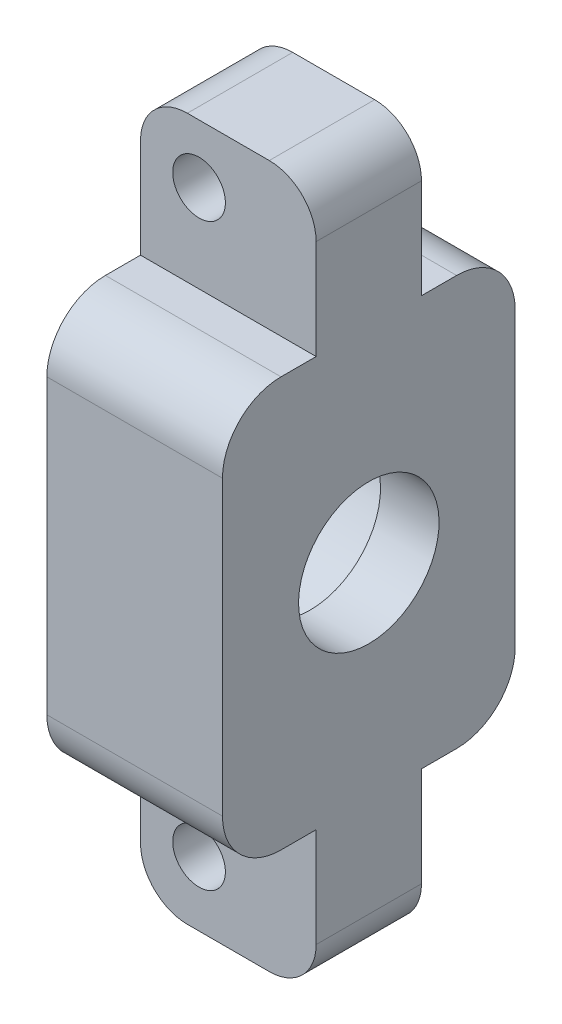
ISO-10303-21;
HEADER;
FILE_DESCRIPTION(('STEP AP214'),'2;1');
FILE_NAME('part.step','',(''),(''),'','','');
FILE_SCHEMA(('AUTOMOTIVE_DESIGN { 1 0 10303 214 1 1 1 1 }'));
ENDSEC;
DATA;
#1=APPLICATION_CONTEXT('core data for automotive mechanical design processes');
#2=APPLICATION_PROTOCOL_DEFINITION('international standard','automotive_design',2000,#1);
#3=PRODUCT_CONTEXT('',#1,'mechanical');
#4=PRODUCT('Part','Part','',(#3));
#5=PRODUCT_RELATED_PRODUCT_CATEGORY('part','',(#4));
#6=PRODUCT_DEFINITION_FORMATION('','',#4);
#7=PRODUCT_DEFINITION_CONTEXT('part definition',#1,'design');
#8=PRODUCT_DEFINITION('design','',#6,#7);
#9=PRODUCT_DEFINITION_SHAPE('','',#8);
#10=(LENGTH_UNIT() NAMED_UNIT(*) SI_UNIT(.MILLI.,.METRE.));
#11=(NAMED_UNIT(*) PLANE_ANGLE_UNIT() SI_UNIT($,.RADIAN.));
#12=(NAMED_UNIT(*) SI_UNIT($,.STERADIAN.) SOLID_ANGLE_UNIT());
#13=UNCERTAINTY_MEASURE_WITH_UNIT(LENGTH_MEASURE(1.E-05),#10,'distance_accuracy_value','');
#14=(GEOMETRIC_REPRESENTATION_CONTEXT(3) GLOBAL_UNCERTAINTY_ASSIGNED_CONTEXT((#13)) GLOBAL_UNIT_ASSIGNED_CONTEXT((#10,
#11,#12)) REPRESENTATION_CONTEXT('',''));
#15=CARTESIAN_POINT('',(0.,0.,0.));
#16=DIRECTION('',(0.,0.,1.));
#17=DIRECTION('',(1.,0.,0.));
#18=AXIS2_PLACEMENT_3D('',#15,#16,#17);
#19=CARTESIAN_POINT('',(7.50000000000001,0.,0.));
#20=DIRECTION('',(-1.,0.,0.));
#21=DIRECTION('',(0.,-1.,0.));
#22=AXIS2_PLACEMENT_3D('',#19,#20,#21);
#23=CYLINDRICAL_SURFACE('',#22,6.);
#24=CARTESIAN_POINT('',(7.50000000000001,0.,0.));
#25=DIRECTION('',(-1.,0.,0.));
#26=DIRECTION('',(0.,-1.,0.));
#27=AXIS2_PLACEMENT_3D('',#24,#25,#26);
#28=CIRCLE('',#27,6.);
#29=CARTESIAN_POINT('',(7.50000000000001,-6.,0.));
#30=VERTEX_POINT('',#29);
#31=EDGE_CURVE('E485',#30,#30,#28,.T.);
#32=ORIENTED_EDGE('',*,*,#31,.F.);
#33=EDGE_LOOP('',(#32));
#34=FACE_BOUND('',#33,.T.);
#35=CARTESIAN_POINT('',(2.5,0.,0.));
#36=DIRECTION('',(-1.,0.,0.));
#37=DIRECTION('',(0.,-1.,0.));
#38=AXIS2_PLACEMENT_3D('',#35,#36,#37);
#39=CIRCLE('',#38,6.);
#40=CARTESIAN_POINT('',(2.5,-6.,0.));
#41=VERTEX_POINT('',#40);
#42=EDGE_CURVE('E43',#41,#41,#39,.F.);
#43=ORIENTED_EDGE('',*,*,#42,.F.);
#44=EDGE_LOOP('',(#43));
#45=FACE_BOUND('',#44,.T.);
#46=ADVANCED_FACE('F39',(#34,#45),#23,.F.);
#47=CARTESIAN_POINT('',(7.5,30.,12.5));
#48=DIRECTION('',(-1.,0.,0.));
#49=DIRECTION('',(0.,-1.,0.));
#50=AXIS2_PLACEMENT_3D('',#47,#48,#49);
#51=PLANE('',#50);
#52=ORIENTED_EDGE('',*,*,#31,.T.);
#53=EDGE_LOOP('',(#52));
#54=FACE_BOUND('',#53,.T.);
#55=DIRECTION('',(0.,1.,0.));
#56=VECTOR('',#55,1.);
#57=CARTESIAN_POINT('',(7.5,0.,4.5));
#58=LINE('',#57,#56);
#59=CARTESIAN_POINT('',(7.5,-26.,4.5));
#60=VERTEX_POINT('',#59);
#61=CARTESIAN_POINT('',(7.5,-17.5,4.5));
#62=VERTEX_POINT('',#61);
#63=EDGE_CURVE('E248',#60,#62,#58,.T.);
#64=ORIENTED_EDGE('',*,*,#63,.F.);
#65=DIRECTION('',(0.,0.,-1.));
#66=VECTOR('',#65,1.);
#67=CARTESIAN_POINT('',(7.5,-26.,12.5));
#68=LINE('',#67,#66);
#69=CARTESIAN_POINT('',(7.5,-26.,-4.5));
#70=VERTEX_POINT('',#69);
#71=EDGE_CURVE('E302',#60,#70,#68,.T.);
#72=ORIENTED_EDGE('',*,*,#71,.T.);
#73=DIRECTION('',(0.,1.,0.));
#74=VECTOR('',#73,1.);
#75=CARTESIAN_POINT('',(7.5,0.,-4.5));
#76=LINE('',#75,#74);
#77=CARTESIAN_POINT('',(7.5,-17.5,-4.5));
#78=VERTEX_POINT('',#77);
#79=EDGE_CURVE('E197',#70,#78,#76,.T.);
#80=ORIENTED_EDGE('',*,*,#79,.T.);
#81=DIRECTION('',(0.,0.,1.));
#82=VECTOR('',#81,1.);
#83=CARTESIAN_POINT('',(7.5,-17.5,0.));
#84=LINE('',#83,#82);
#85=CARTESIAN_POINT('',(7.5,-17.5,-7.5));
#86=VERTEX_POINT('',#85);
#87=EDGE_CURVE('E205',#86,#78,#84,.T.);
#88=ORIENTED_EDGE('',*,*,#87,.F.);
#89=CARTESIAN_POINT('',(7.5,-12.5,-7.5));
#90=DIRECTION('',(-1.,0.,0.));
#91=DIRECTION('',(0.,-1.,0.));
#92=AXIS2_PLACEMENT_3D('',#89,#90,#91);
#93=CIRCLE('',#92,5.);
#94=CARTESIAN_POINT('',(7.5,-12.5,-12.5));
#95=VERTEX_POINT('',#94);
#96=EDGE_CURVE('E280',#86,#95,#93,.F.);
#97=ORIENTED_EDGE('',*,*,#96,.T.);
#98=DIRECTION('',(0.,1.,0.));
#99=VECTOR('',#98,1.);
#100=CARTESIAN_POINT('',(7.5,30.,-12.5));
#101=LINE('',#100,#99);
#102=CARTESIAN_POINT('',(7.5,12.5,-12.5));
#103=VERTEX_POINT('',#102);
#104=EDGE_CURVE('E254',#95,#103,#101,.T.);
#105=ORIENTED_EDGE('',*,*,#104,.T.);
#106=CARTESIAN_POINT('',(7.5,12.5,-7.5));
#107=DIRECTION('',(-1.,0.,0.));
#108=DIRECTION('',(0.,-1.,0.));
#109=AXIS2_PLACEMENT_3D('',#106,#107,#108);
#110=CIRCLE('',#109,5.);
#111=CARTESIAN_POINT('',(7.5,17.5,-7.5));
#112=VERTEX_POINT('',#111);
#113=EDGE_CURVE('E274',#103,#112,#110,.F.);
#114=ORIENTED_EDGE('',*,*,#113,.T.);
#115=DIRECTION('',(0.,0.,1.));
#116=VECTOR('',#115,1.);
#117=CARTESIAN_POINT('',(7.5,17.5,0.));
#118=LINE('',#117,#116);
#119=CARTESIAN_POINT('',(7.5,17.5,-4.5));
#120=VERTEX_POINT('',#119);
#121=EDGE_CURVE('E220',#112,#120,#118,.T.);
#122=ORIENTED_EDGE('',*,*,#121,.T.);
#123=DIRECTION('',(0.,-1.,0.));
#124=VECTOR('',#123,1.);
#125=CARTESIAN_POINT('',(7.5,0.,-4.5));
#126=LINE('',#125,#124);
#127=CARTESIAN_POINT('',(7.5,26.,-4.5));
#128=VERTEX_POINT('',#127);
#129=EDGE_CURVE('E212',#128,#120,#126,.T.);
#130=ORIENTED_EDGE('',*,*,#129,.F.);
#131=DIRECTION('',(0.,0.,-1.));
#132=VECTOR('',#131,1.);
#133=CARTESIAN_POINT('',(7.5,26.,12.5));
#134=LINE('',#133,#132);
#135=CARTESIAN_POINT('',(7.5,26.,4.5));
#136=VERTEX_POINT('',#135);
#137=EDGE_CURVE('E305',#128,#136,#134,.F.);
#138=ORIENTED_EDGE('',*,*,#137,.T.);
#139=DIRECTION('',(0.,-1.,0.));
#140=VECTOR('',#139,1.);
#141=CARTESIAN_POINT('',(7.5,0.,4.5));
#142=LINE('',#141,#140);
#143=CARTESIAN_POINT('',(7.5,17.5,4.5));
#144=VERTEX_POINT('',#143);
#145=EDGE_CURVE('E233',#136,#144,#142,.T.);
#146=ORIENTED_EDGE('',*,*,#145,.T.);
#147=DIRECTION('',(0.,0.,-1.));
#148=VECTOR('',#147,1.);
#149=CARTESIAN_POINT('',(7.5,17.5,0.));
#150=LINE('',#149,#148);
#151=CARTESIAN_POINT('',(7.5,17.5,7.5));
#152=VERTEX_POINT('',#151);
#153=EDGE_CURVE('E232',#152,#144,#150,.T.);
#154=ORIENTED_EDGE('',*,*,#153,.F.);
#155=CARTESIAN_POINT('',(7.5,12.5,7.5));
#156=DIRECTION('',(-1.,0.,0.));
#157=DIRECTION('',(0.,-1.,0.));
#158=AXIS2_PLACEMENT_3D('',#155,#156,#157);
#159=CIRCLE('',#158,5.);
#160=CARTESIAN_POINT('',(7.5,12.5,12.5));
#161=VERTEX_POINT('',#160);
#162=EDGE_CURVE('E272',#152,#161,#159,.F.);
#163=ORIENTED_EDGE('',*,*,#162,.T.);
#164=DIRECTION('',(0.,1.,0.));
#165=VECTOR('',#164,1.);
#166=CARTESIAN_POINT('',(7.5,30.,12.5));
#167=LINE('',#166,#165);
#168=CARTESIAN_POINT('',(7.5,-12.5,12.5));
#169=VERTEX_POINT('',#168);
#170=EDGE_CURVE('E256',#169,#161,#167,.T.);
#171=ORIENTED_EDGE('',*,*,#170,.F.);
#172=CARTESIAN_POINT('',(7.5,-12.5,7.5));
#173=DIRECTION('',(-1.,0.,0.));
#174=DIRECTION('',(0.,-1.,0.));
#175=AXIS2_PLACEMENT_3D('',#172,#173,#174);
#176=CIRCLE('',#175,5.);
#177=CARTESIAN_POINT('',(7.5,-17.5,7.5));
#178=VERTEX_POINT('',#177);
#179=EDGE_CURVE('E276',#169,#178,#176,.F.);
#180=ORIENTED_EDGE('',*,*,#179,.T.);
#181=DIRECTION('',(0.,0.,-1.));
#182=VECTOR('',#181,1.);
#183=CARTESIAN_POINT('',(7.5,-17.5,0.));
#184=LINE('',#183,#182);
#185=EDGE_CURVE('E206',#178,#62,#184,.T.);
#186=ORIENTED_EDGE('',*,*,#185,.T.);
#187=EDGE_LOOP('',(#64,#72,#80,#88,#97,#105,#114,#122,#130,#138,#146,#154,#163,#171,#180,#186));
#188=FACE_BOUND('',#187,.T.);
#189=ADVANCED_FACE('F353',(#54,#188),#51,.F.);
#190=CARTESIAN_POINT('',(-7.5,30.,12.5));
#191=DIRECTION('',(0.,-1.,0.));
#192=DIRECTION('',(0.,0.,-1.));
#193=AXIS2_PLACEMENT_3D('',#190,#191,#192);
#194=PLANE('',#193);
#195=DIRECTION('',(1.,0.,0.));
#196=VECTOR('',#195,1.);
#197=CARTESIAN_POINT('',(-7.50000000000001,30.,-4.5));
#198=LINE('',#197,#196);
#199=CARTESIAN_POINT('',(-3.5,30.,-4.5));
#200=VERTEX_POINT('',#199);
#201=CARTESIAN_POINT('',(3.5,30.,-4.5));
#202=VERTEX_POINT('',#201);
#203=EDGE_CURVE('E216',#200,#202,#198,.T.);
#204=ORIENTED_EDGE('',*,*,#203,.F.);
#205=DIRECTION('',(0.,0.,-1.));
#206=VECTOR('',#205,1.);
#207=CARTESIAN_POINT('',(-3.5,30.,12.5));
#208=LINE('',#207,#206);
#209=CARTESIAN_POINT('',(-3.5,30.,4.5));
#210=VERTEX_POINT('',#209);
#211=EDGE_CURVE('E62',#200,#210,#208,.F.);
#212=ORIENTED_EDGE('',*,*,#211,.T.);
#213=DIRECTION('',(1.,0.,0.));
#214=VECTOR('',#213,1.);
#215=CARTESIAN_POINT('',(-7.50000000000001,30.,4.5));
#216=LINE('',#215,#214);
#217=CARTESIAN_POINT('',(3.5,30.,4.5));
#218=VERTEX_POINT('',#217);
#219=EDGE_CURVE('E219',#210,#218,#216,.T.);
#220=ORIENTED_EDGE('',*,*,#219,.T.);
#221=DIRECTION('',(0.,0.,-1.));
#222=VECTOR('',#221,1.);
#223=CARTESIAN_POINT('',(3.5,30.,12.5));
#224=LINE('',#223,#222);
#225=EDGE_CURVE('E327',#218,#202,#224,.T.);
#226=ORIENTED_EDGE('',*,*,#225,.T.);
#227=EDGE_LOOP('',(#204,#212,#220,#226));
#228=FACE_BOUND('',#227,.T.);
#229=ADVANCED_FACE('F334',(#228),#194,.F.);
#230=CARTESIAN_POINT('',(-7.5,30.,12.5));
#231=DIRECTION('',(1.,0.,0.));
#232=DIRECTION('',(0.,1.,0.));
#233=AXIS2_PLACEMENT_3D('',#230,#231,#232);
#234=PLANE('',#233);
#235=CARTESIAN_POINT('',(-7.5,0.,0.));
#236=DIRECTION('',(-1.,0.,0.));
#237=DIRECTION('',(0.,-1.,0.));
#238=AXIS2_PLACEMENT_3D('',#235,#236,#237);
#239=CIRCLE('',#238,10.);
#240=CARTESIAN_POINT('',(-7.5,-10.,0.));
#241=VERTEX_POINT('',#240);
#242=EDGE_CURVE('E490',#241,#241,#239,.T.);
#243=ORIENTED_EDGE('',*,*,#242,.F.);
#244=EDGE_LOOP('',(#243));
#245=FACE_BOUND('',#244,.T.);
#246=DIRECTION('',(0.,1.,0.));
#247=VECTOR('',#246,1.);
#248=CARTESIAN_POINT('',(-7.50000000000001,0.,-4.5));
#249=LINE('',#248,#247);
#250=CARTESIAN_POINT('',(-7.5,-26.,-4.5));
#251=VERTEX_POINT('',#250);
#252=CARTESIAN_POINT('',(-7.50000000000001,-17.5,-4.5));
#253=VERTEX_POINT('',#252);
#254=EDGE_CURVE('E180',#251,#253,#249,.T.);
#255=ORIENTED_EDGE('',*,*,#254,.F.);
#256=DIRECTION('',(0.,0.,-1.));
#257=VECTOR('',#256,1.);
#258=CARTESIAN_POINT('',(-7.5,-26.,12.5));
#259=LINE('',#258,#257);
#260=CARTESIAN_POINT('',(-7.5,-26.,4.5));
#261=VERTEX_POINT('',#260);
#262=EDGE_CURVE('E325',#251,#261,#259,.F.);
#263=ORIENTED_EDGE('',*,*,#262,.T.);
#264=DIRECTION('',(0.,1.,0.));
#265=VECTOR('',#264,1.);
#266=CARTESIAN_POINT('',(-7.50000000000001,0.,4.5));
#267=LINE('',#266,#265);
#268=CARTESIAN_POINT('',(-7.50000000000001,-17.5,4.5));
#269=VERTEX_POINT('',#268);
#270=EDGE_CURVE('E243',#261,#269,#267,.T.);
#271=ORIENTED_EDGE('',*,*,#270,.T.);
#272=DIRECTION('',(0.,0.,-1.));
#273=VECTOR('',#272,1.);
#274=CARTESIAN_POINT('',(-7.50000000000001,-17.5,0.));
#275=LINE('',#274,#273);
#276=CARTESIAN_POINT('',(-7.50000000000001,-17.5,7.5));
#277=VERTEX_POINT('',#276);
#278=EDGE_CURVE('E244',#277,#269,#275,.T.);
#279=ORIENTED_EDGE('',*,*,#278,.F.);
#280=CARTESIAN_POINT('',(-7.5,-12.5,7.5));
#281=DIRECTION('',(1.,0.,0.));
#282=DIRECTION('',(0.,1.,0.));
#283=AXIS2_PLACEMENT_3D('',#280,#281,#282);
#284=CIRCLE('',#283,5.);
#285=CARTESIAN_POINT('',(-7.5,-12.5,12.5));
#286=VERTEX_POINT('',#285);
#287=EDGE_CURVE('E286',#277,#286,#284,.F.);
#288=ORIENTED_EDGE('',*,*,#287,.T.);
#289=DIRECTION('',(0.,-1.,0.));
#290=VECTOR('',#289,1.);
#291=CARTESIAN_POINT('',(-7.5,30.,12.5));
#292=LINE('',#291,#290);
#293=CARTESIAN_POINT('',(-7.5,12.5,12.5));
#294=VERTEX_POINT('',#293);
#295=EDGE_CURVE('E261',#294,#286,#292,.T.);
#296=ORIENTED_EDGE('',*,*,#295,.F.);
#297=CARTESIAN_POINT('',(-7.5,12.5,7.5));
#298=DIRECTION('',(1.,0.,0.));
#299=DIRECTION('',(0.,1.,0.));
#300=AXIS2_PLACEMENT_3D('',#297,#298,#299);
#301=CIRCLE('',#300,5.);
#302=CARTESIAN_POINT('',(-7.50000000000001,17.5,7.5));
#303=VERTEX_POINT('',#302);
#304=EDGE_CURVE('E285',#294,#303,#301,.F.);
#305=ORIENTED_EDGE('',*,*,#304,.T.);
#306=DIRECTION('',(0.,0.,-1.));
#307=VECTOR('',#306,1.);
#308=CARTESIAN_POINT('',(-7.50000000000001,17.5,0.));
#309=LINE('',#308,#307);
#310=CARTESIAN_POINT('',(-7.50000000000001,17.5,4.5));
#311=VERTEX_POINT('',#310);
#312=EDGE_CURVE('E229',#303,#311,#309,.T.);
#313=ORIENTED_EDGE('',*,*,#312,.T.);
#314=DIRECTION('',(0.,-1.,0.));
#315=VECTOR('',#314,1.);
#316=CARTESIAN_POINT('',(-7.50000000000001,0.,4.5));
#317=LINE('',#316,#315);
#318=CARTESIAN_POINT('',(-7.50000000000001,26.,4.5));
#319=VERTEX_POINT('',#318);
#320=EDGE_CURVE('E228',#319,#311,#317,.T.);
#321=ORIENTED_EDGE('',*,*,#320,.F.);
#322=DIRECTION('',(0.,0.,-1.));
#323=VECTOR('',#322,1.);
#324=CARTESIAN_POINT('',(-7.5,26.,12.5));
#325=LINE('',#324,#323);
#326=CARTESIAN_POINT('',(-7.50000000000001,26.,-4.5));
#327=VERTEX_POINT('',#326);
#328=EDGE_CURVE('E317',#319,#327,#325,.T.);
#329=ORIENTED_EDGE('',*,*,#328,.T.);
#330=DIRECTION('',(0.,-1.,0.));
#331=VECTOR('',#330,1.);
#332=CARTESIAN_POINT('',(-7.50000000000001,0.,-4.5));
#333=LINE('',#332,#331);
#334=CARTESIAN_POINT('',(-7.50000000000001,17.5,-4.5));
#335=VERTEX_POINT('',#334);
#336=EDGE_CURVE('E213',#327,#335,#333,.T.);
#337=ORIENTED_EDGE('',*,*,#336,.T.);
#338=DIRECTION('',(0.,0.,1.));
#339=VECTOR('',#338,1.);
#340=CARTESIAN_POINT('',(-7.50000000000001,17.5,0.));
#341=LINE('',#340,#339);
#342=CARTESIAN_POINT('',(-7.50000000000001,17.5,-7.5));
#343=VERTEX_POINT('',#342);
#344=EDGE_CURVE('E209',#343,#335,#341,.T.);
#345=ORIENTED_EDGE('',*,*,#344,.F.);
#346=CARTESIAN_POINT('',(-7.5,12.5,-7.5));
#347=DIRECTION('',(1.,0.,0.));
#348=DIRECTION('',(0.,1.,0.));
#349=AXIS2_PLACEMENT_3D('',#346,#347,#348);
#350=CIRCLE('',#349,5.);
#351=CARTESIAN_POINT('',(-7.5,12.5,-12.5));
#352=VERTEX_POINT('',#351);
#353=EDGE_CURVE('E283',#343,#352,#350,.F.);
#354=ORIENTED_EDGE('',*,*,#353,.T.);
#355=DIRECTION('',(0.,-1.,0.));
#356=VECTOR('',#355,1.);
#357=CARTESIAN_POINT('',(-7.5,30.,-12.5));
#358=LINE('',#357,#356);
#359=CARTESIAN_POINT('',(-7.5,-12.5,-12.5));
#360=VERTEX_POINT('',#359);
#361=EDGE_CURVE('E265',#352,#360,#358,.T.);
#362=ORIENTED_EDGE('',*,*,#361,.T.);
#363=CARTESIAN_POINT('',(-7.5,-12.5,-7.5));
#364=DIRECTION('',(1.,0.,0.));
#365=DIRECTION('',(0.,1.,0.));
#366=AXIS2_PLACEMENT_3D('',#363,#364,#365);
#367=CIRCLE('',#366,5.);
#368=CARTESIAN_POINT('',(-7.50000000000001,-17.5,-7.5));
#369=VERTEX_POINT('',#368);
#370=EDGE_CURVE('E191',#360,#369,#367,.F.);
#371=ORIENTED_EDGE('',*,*,#370,.T.);
#372=DIRECTION('',(0.,0.,1.));
#373=VECTOR('',#372,1.);
#374=CARTESIAN_POINT('',(-7.50000000000001,-17.5,0.));
#375=LINE('',#374,#373);
#376=EDGE_CURVE('E189',#369,#253,#375,.T.);
#377=ORIENTED_EDGE('',*,*,#376,.T.);
#378=EDGE_LOOP('',(#255,#263,#271,#279,#288,#296,#305,#313,#321,#329,#337,#345,#354,#362,#371,#377));
#379=FACE_BOUND('',#378,.T.);
#380=ADVANCED_FACE('F188',(#245,#379),#234,.F.);
#381=CARTESIAN_POINT('',(-7.5,-30.,12.5));
#382=DIRECTION('',(0.,1.,0.));
#383=DIRECTION('',(0.,0.,1.));
#384=AXIS2_PLACEMENT_3D('',#381,#382,#383);
#385=PLANE('',#384);
#386=DIRECTION('',(1.,0.,0.));
#387=VECTOR('',#386,1.);
#388=CARTESIAN_POINT('',(-7.5,-30.,-4.5));
#389=LINE('',#388,#387);
#390=CARTESIAN_POINT('',(-3.5,-30.,-4.5));
#391=VERTEX_POINT('',#390);
#392=CARTESIAN_POINT('',(3.5,-30.,-4.5));
#393=VERTEX_POINT('',#392);
#394=EDGE_CURVE('E201',#391,#393,#389,.T.);
#395=ORIENTED_EDGE('',*,*,#394,.T.);
#396=DIRECTION('',(0.,0.,-1.));
#397=VECTOR('',#396,1.);
#398=CARTESIAN_POINT('',(3.5,-30.,12.5));
#399=LINE('',#398,#397);
#400=CARTESIAN_POINT('',(3.5,-30.,4.5));
#401=VERTEX_POINT('',#400);
#402=EDGE_CURVE('E311',#393,#401,#399,.F.);
#403=ORIENTED_EDGE('',*,*,#402,.T.);
#404=DIRECTION('',(1.,0.,0.));
#405=VECTOR('',#404,1.);
#406=CARTESIAN_POINT('',(-7.5,-30.,4.5));
#407=LINE('',#406,#405);
#408=CARTESIAN_POINT('',(-3.5,-30.,4.5));
#409=VERTEX_POINT('',#408);
#410=EDGE_CURVE('E246',#409,#401,#407,.T.);
#411=ORIENTED_EDGE('',*,*,#410,.F.);
#412=DIRECTION('',(0.,0.,-1.));
#413=VECTOR('',#412,1.);
#414=CARTESIAN_POINT('',(-3.5,-30.,12.5));
#415=LINE('',#414,#413);
#416=EDGE_CURVE('E309',#409,#391,#415,.T.);
#417=ORIENTED_EDGE('',*,*,#416,.T.);
#418=EDGE_LOOP('',(#395,#403,#411,#417));
#419=FACE_BOUND('',#418,.T.);
#420=ADVANCED_FACE('F420',(#419),#385,.F.);
#421=CARTESIAN_POINT('',(0.,0.,12.5));
#422=DIRECTION('',(0.,0.,1.));
#423=DIRECTION('',(1.,0.,0.));
#424=AXIS2_PLACEMENT_3D('',#421,#422,#423);
#425=PLANE('',#424);
#426=ORIENTED_EDGE('',*,*,#295,.T.);
#427=DIRECTION('',(1.,0.,0.));
#428=VECTOR('',#427,1.);
#429=CARTESIAN_POINT('',(0.,-12.5,12.5));
#430=LINE('',#429,#428);
#431=EDGE_CURVE('E269',#286,#169,#430,.T.);
#432=ORIENTED_EDGE('',*,*,#431,.T.);
#433=ORIENTED_EDGE('',*,*,#170,.T.);
#434=DIRECTION('',(1.,0.,0.));
#435=VECTOR('',#434,1.);
#436=CARTESIAN_POINT('',(-7.5,12.5,12.5));
#437=LINE('',#436,#435);
#438=EDGE_CURVE('E264',#161,#294,#437,.F.);
#439=ORIENTED_EDGE('',*,*,#438,.T.);
#440=EDGE_LOOP('',(#426,#432,#433,#439));
#441=FACE_BOUND('',#440,.T.);
#442=ADVANCED_FACE('F418',(#441),#425,.T.);
#443=CARTESIAN_POINT('',(0.,0.,-12.5));
#444=DIRECTION('',(0.,0.,1.));
#445=DIRECTION('',(1.,0.,0.));
#446=AXIS2_PLACEMENT_3D('',#443,#444,#445);
#447=PLANE('',#446);
#448=ORIENTED_EDGE('',*,*,#104,.F.);
#449=DIRECTION('',(1.,0.,0.));
#450=VECTOR('',#449,1.);
#451=CARTESIAN_POINT('',(0.,-12.5,-12.5));
#452=LINE('',#451,#450);
#453=EDGE_CURVE('E293',#95,#360,#452,.F.);
#454=ORIENTED_EDGE('',*,*,#453,.T.);
#455=ORIENTED_EDGE('',*,*,#361,.F.);
#456=DIRECTION('',(1.,0.,0.));
#457=VECTOR('',#456,1.);
#458=CARTESIAN_POINT('',(7.5,12.5,-12.5));
#459=LINE('',#458,#457);
#460=EDGE_CURVE('E295',#352,#103,#459,.T.);
#461=ORIENTED_EDGE('',*,*,#460,.T.);
#462=EDGE_LOOP('',(#448,#454,#455,#461));
#463=FACE_BOUND('',#462,.T.);
#464=ADVANCED_FACE('F394',(#463),#447,.F.);
#465=CARTESIAN_POINT('',(-7.50000000000001,0.,-4.5));
#466=DIRECTION('',(0.,0.,-1.));
#467=DIRECTION('',(0.,1.,0.));
#468=AXIS2_PLACEMENT_3D('',#465,#466,#467);
#469=PLANE('',#468);
#470=CARTESIAN_POINT('',(-2.5,-24.5,-4.5));
#471=DIRECTION('',(0.,0.,-1.));
#472=DIRECTION('',(0.,1.,0.));
#473=AXIS2_PLACEMENT_3D('',#470,#471,#472);
#474=CIRCLE('',#473,2.25);
#475=CARTESIAN_POINT('',(-2.5,-22.25,-4.5));
#476=VERTEX_POINT('',#475);
#477=EDGE_CURVE('E240',#476,#476,#474,.T.);
#478=ORIENTED_EDGE('',*,*,#477,.F.);
#479=EDGE_LOOP('',(#478));
#480=FACE_BOUND('',#479,.T.);
#481=ORIENTED_EDGE('',*,*,#79,.F.);
#482=CARTESIAN_POINT('',(3.5,-26.,-4.5));
#483=DIRECTION('',(0.,0.,-1.));
#484=DIRECTION('',(0.,1.,0.));
#485=AXIS2_PLACEMENT_3D('',#482,#483,#484);
#486=CIRCLE('',#485,4.);
#487=EDGE_CURVE('E306',#70,#393,#486,.T.);
#488=ORIENTED_EDGE('',*,*,#487,.T.);
#489=ORIENTED_EDGE('',*,*,#394,.F.);
#490=CARTESIAN_POINT('',(-3.5,-26.,-4.5));
#491=DIRECTION('',(0.,0.,-1.));
#492=DIRECTION('',(0.,1.,0.));
#493=AXIS2_PLACEMENT_3D('',#490,#491,#492);
#494=CIRCLE('',#493,4.);
#495=EDGE_CURVE('E184',#391,#251,#494,.T.);
#496=ORIENTED_EDGE('',*,*,#495,.T.);
#497=ORIENTED_EDGE('',*,*,#254,.T.);
#498=DIRECTION('',(1.,0.,0.));
#499=VECTOR('',#498,1.);
#500=CARTESIAN_POINT('',(-7.50000000000001,-17.5,-4.5));
#501=LINE('',#500,#499);
#502=EDGE_CURVE('E185',#253,#78,#501,.T.);
#503=ORIENTED_EDGE('',*,*,#502,.T.);
#504=EDGE_LOOP('',(#481,#488,#489,#496,#497,#503));
#505=FACE_BOUND('',#504,.T.);
#506=ADVANCED_FACE('F179',(#480,#505),#469,.T.);
#507=CARTESIAN_POINT('',(-7.50000000000001,-17.5,0.));
#508=DIRECTION('',(0.,1.,0.));
#509=DIRECTION('',(-1.,0.,0.));
#510=AXIS2_PLACEMENT_3D('',#507,#508,#509);
#511=PLANE('',#510);
#512=ORIENTED_EDGE('',*,*,#376,.F.);
#513=DIRECTION('',(1.,0.,0.));
#514=VECTOR('',#513,1.);
#515=CARTESIAN_POINT('',(-7.50000000000001,-17.5,-7.5));
#516=LINE('',#515,#514);
#517=EDGE_CURVE('E289',#369,#86,#516,.T.);
#518=ORIENTED_EDGE('',*,*,#517,.T.);
#519=ORIENTED_EDGE('',*,*,#87,.T.);
#520=ORIENTED_EDGE('',*,*,#502,.F.);
#521=EDGE_LOOP('',(#512,#518,#519,#520));
#522=FACE_BOUND('',#521,.T.);
#523=ADVANCED_FACE('F199',(#522),#511,.F.);
#524=CARTESIAN_POINT('',(-7.50000000000001,17.5,0.));
#525=DIRECTION('',(0.,1.,0.));
#526=DIRECTION('',(-1.,0.,0.));
#527=AXIS2_PLACEMENT_3D('',#524,#525,#526);
#528=PLANE('',#527);
#529=ORIENTED_EDGE('',*,*,#121,.F.);
#530=DIRECTION('',(1.,0.,0.));
#531=VECTOR('',#530,1.);
#532=CARTESIAN_POINT('',(-7.50000000000001,17.5,-7.5));
#533=LINE('',#532,#531);
#534=EDGE_CURVE('E299',#112,#343,#533,.F.);
#535=ORIENTED_EDGE('',*,*,#534,.T.);
#536=ORIENTED_EDGE('',*,*,#344,.T.);
#537=DIRECTION('',(1.,0.,0.));
#538=VECTOR('',#537,1.);
#539=CARTESIAN_POINT('',(-7.50000000000001,17.5,-4.5));
#540=LINE('',#539,#538);
#541=EDGE_CURVE('E225',#335,#120,#540,.T.);
#542=ORIENTED_EDGE('',*,*,#541,.T.);
#543=EDGE_LOOP('',(#529,#535,#536,#542));
#544=FACE_BOUND('',#543,.T.);
#545=ADVANCED_FACE('F398',(#544),#528,.T.);
#546=CARTESIAN_POINT('',(-7.50000000000001,0.,-4.5));
#547=DIRECTION('',(0.,0.,1.));
#548=DIRECTION('',(0.,-1.,0.));
#549=AXIS2_PLACEMENT_3D('',#546,#547,#548);
#550=PLANE('',#549);
#551=CARTESIAN_POINT('',(-2.50000000000001,25.,-4.5));
#552=DIRECTION('',(0.,0.,1.));
#553=DIRECTION('',(0.,-1.,0.));
#554=AXIS2_PLACEMENT_3D('',#551,#552,#553);
#555=CIRCLE('',#554,2.25);
#556=CARTESIAN_POINT('',(-2.50000000000001,22.75,-4.5));
#557=VERTEX_POINT('',#556);
#558=EDGE_CURVE('E474',#557,#557,#555,.T.);
#559=ORIENTED_EDGE('',*,*,#558,.T.);
#560=EDGE_LOOP('',(#559));
#561=FACE_BOUND('',#560,.T.);
#562=ORIENTED_EDGE('',*,*,#336,.F.);
#563=CARTESIAN_POINT('',(-3.5,26.,-4.5));
#564=DIRECTION('',(0.,0.,1.));
#565=DIRECTION('',(0.,-1.,0.));
#566=AXIS2_PLACEMENT_3D('',#563,#564,#565);
#567=CIRCLE('',#566,4.);
#568=EDGE_CURVE('E326',#327,#200,#567,.F.);
#569=ORIENTED_EDGE('',*,*,#568,.T.);
#570=ORIENTED_EDGE('',*,*,#203,.T.);
#571=CARTESIAN_POINT('',(3.5,26.,-4.5));
#572=DIRECTION('',(0.,0.,1.));
#573=DIRECTION('',(0.,-1.,0.));
#574=AXIS2_PLACEMENT_3D('',#571,#572,#573);
#575=CIRCLE('',#574,4.);
#576=EDGE_CURVE('E322',#202,#128,#575,.F.);
#577=ORIENTED_EDGE('',*,*,#576,.T.);
#578=ORIENTED_EDGE('',*,*,#129,.T.);
#579=ORIENTED_EDGE('',*,*,#541,.F.);
#580=EDGE_LOOP('',(#562,#569,#570,#577,#578,#579));
#581=FACE_BOUND('',#580,.T.);
#582=ADVANCED_FACE('F339',(#561,#581),#550,.F.);
#583=CARTESIAN_POINT('',(-7.50000000000001,-17.5,0.));
#584=DIRECTION('',(0.,-1.,0.));
#585=DIRECTION('',(1.,0.,0.));
#586=AXIS2_PLACEMENT_3D('',#583,#584,#585);
#587=PLANE('',#586);
#588=ORIENTED_EDGE('',*,*,#185,.F.);
#589=DIRECTION('',(1.,0.,0.));
#590=VECTOR('',#589,1.);
#591=CARTESIAN_POINT('',(-7.50000000000001,-17.5,7.5));
#592=LINE('',#591,#590);
#593=EDGE_CURVE('E282',#178,#277,#592,.F.);
#594=ORIENTED_EDGE('',*,*,#593,.T.);
#595=ORIENTED_EDGE('',*,*,#278,.T.);
#596=DIRECTION('',(1.,0.,0.));
#597=VECTOR('',#596,1.);
#598=CARTESIAN_POINT('',(-7.50000000000001,-17.5,4.5));
#599=LINE('',#598,#597);
#600=EDGE_CURVE('E252',#269,#62,#599,.T.);
#601=ORIENTED_EDGE('',*,*,#600,.T.);
#602=EDGE_LOOP('',(#588,#594,#595,#601));
#603=FACE_BOUND('',#602,.T.);
#604=ADVANCED_FACE('F397',(#603),#587,.T.);
#605=CARTESIAN_POINT('',(-7.50000000000001,0.,4.5));
#606=DIRECTION('',(0.,0.,-1.));
#607=DIRECTION('',(0.,1.,0.));
#608=AXIS2_PLACEMENT_3D('',#605,#606,#607);
#609=PLANE('',#608);
#610=CARTESIAN_POINT('',(-2.5,-24.5,4.5));
#611=DIRECTION('',(0.,0.,1.));
#612=DIRECTION('',(1.,0.,0.));
#613=AXIS2_PLACEMENT_3D('',#610,#611,#612);
#614=CIRCLE('',#613,2.25);
#615=CARTESIAN_POINT('',(-0.250000000000006,-24.5,4.5));
#616=VERTEX_POINT('',#615);
#617=EDGE_CURVE('E479',#616,#616,#614,.T.);
#618=ORIENTED_EDGE('',*,*,#617,.F.);
#619=EDGE_LOOP('',(#618));
#620=FACE_BOUND('',#619,.T.);
#621=ORIENTED_EDGE('',*,*,#410,.T.);
#622=CARTESIAN_POINT('',(3.5,-26.,4.5));
#623=DIRECTION('',(0.,0.,-1.));
#624=DIRECTION('',(0.,1.,0.));
#625=AXIS2_PLACEMENT_3D('',#622,#623,#624);
#626=CIRCLE('',#625,4.);
#627=EDGE_CURVE('E320',#401,#60,#626,.F.);
#628=ORIENTED_EDGE('',*,*,#627,.T.);
#629=ORIENTED_EDGE('',*,*,#63,.T.);
#630=ORIENTED_EDGE('',*,*,#600,.F.);
#631=ORIENTED_EDGE('',*,*,#270,.F.);
#632=CARTESIAN_POINT('',(-3.5,-26.,4.5));
#633=DIRECTION('',(0.,0.,-1.));
#634=DIRECTION('',(0.,1.,0.));
#635=AXIS2_PLACEMENT_3D('',#632,#633,#634);
#636=CIRCLE('',#635,4.);
#637=EDGE_CURVE('E312',#261,#409,#636,.F.);
#638=ORIENTED_EDGE('',*,*,#637,.T.);
#639=EDGE_LOOP('',(#621,#628,#629,#630,#631,#638));
#640=FACE_BOUND('',#639,.T.);
#641=ADVANCED_FACE('F407',(#620,#640),#609,.F.);
#642=CARTESIAN_POINT('',(-7.50000000000001,0.,4.5));
#643=DIRECTION('',(0.,0.,1.));
#644=DIRECTION('',(0.,-1.,0.));
#645=AXIS2_PLACEMENT_3D('',#642,#643,#644);
#646=PLANE('',#645);
#647=CARTESIAN_POINT('',(-2.50000000000001,25.,4.5));
#648=DIRECTION('',(0.,0.,1.));
#649=DIRECTION('',(1.,0.,0.));
#650=AXIS2_PLACEMENT_3D('',#647,#648,#649);
#651=CIRCLE('',#650,2.25);
#652=CARTESIAN_POINT('',(-0.250000000000014,25.,4.5));
#653=VERTEX_POINT('',#652);
#654=EDGE_CURVE('E476',#653,#653,#651,.T.);
#655=ORIENTED_EDGE('',*,*,#654,.F.);
#656=EDGE_LOOP('',(#655));
#657=FACE_BOUND('',#656,.T.);
#658=ORIENTED_EDGE('',*,*,#219,.F.);
#659=CARTESIAN_POINT('',(-3.5,26.,4.5));
#660=DIRECTION('',(0.,0.,1.));
#661=DIRECTION('',(0.,-1.,0.));
#662=AXIS2_PLACEMENT_3D('',#659,#660,#661);
#663=CIRCLE('',#662,4.);
#664=EDGE_CURVE('E11',#210,#319,#663,.T.);
#665=ORIENTED_EDGE('',*,*,#664,.T.);
#666=ORIENTED_EDGE('',*,*,#320,.T.);
#667=DIRECTION('',(1.,0.,0.));
#668=VECTOR('',#667,1.);
#669=CARTESIAN_POINT('',(-7.50000000000001,17.5,4.5));
#670=LINE('',#669,#668);
#671=EDGE_CURVE('E231',#311,#144,#670,.T.);
#672=ORIENTED_EDGE('',*,*,#671,.T.);
#673=ORIENTED_EDGE('',*,*,#145,.F.);
#674=CARTESIAN_POINT('',(3.5,26.,4.5));
#675=DIRECTION('',(0.,0.,1.));
#676=DIRECTION('',(0.,-1.,0.));
#677=AXIS2_PLACEMENT_3D('',#674,#675,#676);
#678=CIRCLE('',#677,4.);
#679=EDGE_CURVE('E48',#136,#218,#678,.T.);
#680=ORIENTED_EDGE('',*,*,#679,.T.);
#681=EDGE_LOOP('',(#658,#665,#666,#672,#673,#680));
#682=FACE_BOUND('',#681,.T.);
#683=ADVANCED_FACE('F346',(#657,#682),#646,.T.);
#684=CARTESIAN_POINT('',(-7.50000000000001,17.5,0.));
#685=DIRECTION('',(0.,-1.,0.));
#686=DIRECTION('',(1.,0.,0.));
#687=AXIS2_PLACEMENT_3D('',#684,#685,#686);
#688=PLANE('',#687);
#689=ORIENTED_EDGE('',*,*,#312,.F.);
#690=DIRECTION('',(1.,0.,0.));
#691=VECTOR('',#690,1.);
#692=CARTESIAN_POINT('',(7.5,17.5,7.5));
#693=LINE('',#692,#691);
#694=EDGE_CURVE('E296',#303,#152,#693,.T.);
#695=ORIENTED_EDGE('',*,*,#694,.T.);
#696=ORIENTED_EDGE('',*,*,#153,.T.);
#697=ORIENTED_EDGE('',*,*,#671,.F.);
#698=EDGE_LOOP('',(#689,#695,#696,#697));
#699=FACE_BOUND('',#698,.T.);
#700=ADVANCED_FACE('F348',(#699),#688,.F.);
#701=CARTESIAN_POINT('',(-2.50000000000001,25.,-12.5));
#702=DIRECTION('',(0.,0.,1.));
#703=DIRECTION('',(1.,0.,0.));
#704=AXIS2_PLACEMENT_3D('',#701,#702,#703);
#705=CYLINDRICAL_SURFACE('',#704,2.25);
#706=ORIENTED_EDGE('',*,*,#654,.T.);
#707=EDGE_LOOP('',(#706));
#708=FACE_BOUND('',#707,.T.);
#709=ORIENTED_EDGE('',*,*,#558,.F.);
#710=EDGE_LOOP('',(#709));
#711=FACE_BOUND('',#710,.T.);
#712=ADVANCED_FACE('F381',(#708,#711),#705,.F.);
#713=CARTESIAN_POINT('',(-2.5,-24.5,-12.5));
#714=DIRECTION('',(0.,0.,1.));
#715=DIRECTION('',(1.,0.,0.));
#716=AXIS2_PLACEMENT_3D('',#713,#714,#715);
#717=CYLINDRICAL_SURFACE('',#716,2.25);
#718=ORIENTED_EDGE('',*,*,#477,.T.);
#719=EDGE_LOOP('',(#718));
#720=FACE_BOUND('',#719,.T.);
#721=ORIENTED_EDGE('',*,*,#617,.T.);
#722=EDGE_LOOP('',(#721));
#723=FACE_BOUND('',#722,.T.);
#724=ADVANCED_FACE('F383',(#720,#723),#717,.F.);
#725=CARTESIAN_POINT('',(0.,-12.5,7.5));
#726=DIRECTION('',(1.,0.,0.));
#727=DIRECTION('',(0.,1.,0.));
#728=AXIS2_PLACEMENT_3D('',#725,#726,#727);
#729=CYLINDRICAL_SURFACE('',#728,5.);
#730=ORIENTED_EDGE('',*,*,#287,.F.);
#731=ORIENTED_EDGE('',*,*,#593,.F.);
#732=ORIENTED_EDGE('',*,*,#179,.F.);
#733=ORIENTED_EDGE('',*,*,#431,.F.);
#734=EDGE_LOOP('',(#730,#731,#732,#733));
#735=FACE_BOUND('',#734,.T.);
#736=ADVANCED_FACE('F389',(#735),#729,.T.);
#737=CARTESIAN_POINT('',(-7.50000000000001,-12.5,-7.5));
#738=DIRECTION('',(1.,0.,0.));
#739=DIRECTION('',(0.,1.,0.));
#740=AXIS2_PLACEMENT_3D('',#737,#738,#739);
#741=CYLINDRICAL_SURFACE('',#740,5.);
#742=ORIENTED_EDGE('',*,*,#370,.F.);
#743=ORIENTED_EDGE('',*,*,#453,.F.);
#744=ORIENTED_EDGE('',*,*,#96,.F.);
#745=ORIENTED_EDGE('',*,*,#517,.F.);
#746=EDGE_LOOP('',(#742,#743,#744,#745));
#747=FACE_BOUND('',#746,.T.);
#748=ADVANCED_FACE('F433',(#747),#741,.T.);
#749=CARTESIAN_POINT('',(0.,12.5,-7.5));
#750=DIRECTION('',(-1.,0.,0.));
#751=DIRECTION('',(0.,-1.,0.));
#752=AXIS2_PLACEMENT_3D('',#749,#750,#751);
#753=CYLINDRICAL_SURFACE('',#752,5.);
#754=ORIENTED_EDGE('',*,*,#353,.F.);
#755=ORIENTED_EDGE('',*,*,#534,.F.);
#756=ORIENTED_EDGE('',*,*,#113,.F.);
#757=ORIENTED_EDGE('',*,*,#460,.F.);
#758=EDGE_LOOP('',(#754,#755,#756,#757));
#759=FACE_BOUND('',#758,.T.);
#760=ADVANCED_FACE('F440',(#759),#753,.T.);
#761=CARTESIAN_POINT('',(-7.50000000000001,12.5,7.5));
#762=DIRECTION('',(-1.,0.,0.));
#763=DIRECTION('',(0.,-1.,0.));
#764=AXIS2_PLACEMENT_3D('',#761,#762,#763);
#765=CYLINDRICAL_SURFACE('',#764,5.);
#766=ORIENTED_EDGE('',*,*,#304,.F.);
#767=ORIENTED_EDGE('',*,*,#438,.F.);
#768=ORIENTED_EDGE('',*,*,#162,.F.);
#769=ORIENTED_EDGE('',*,*,#694,.F.);
#770=EDGE_LOOP('',(#766,#767,#768,#769));
#771=FACE_BOUND('',#770,.T.);
#772=ADVANCED_FACE('F442',(#771),#765,.T.);
#773=CARTESIAN_POINT('',(3.5,-26.,12.5));
#774=DIRECTION('',(0.,0.,-1.));
#775=DIRECTION('',(-1.,0.,0.));
#776=AXIS2_PLACEMENT_3D('',#773,#774,#775);
#777=CYLINDRICAL_SURFACE('',#776,4.);
#778=ORIENTED_EDGE('',*,*,#627,.F.);
#779=ORIENTED_EDGE('',*,*,#402,.F.);
#780=ORIENTED_EDGE('',*,*,#487,.F.);
#781=ORIENTED_EDGE('',*,*,#71,.F.);
#782=EDGE_LOOP('',(#778,#779,#780,#781));
#783=FACE_BOUND('',#782,.T.);
#784=ADVANCED_FACE('F443',(#783),#777,.T.);
#785=CARTESIAN_POINT('',(-3.5,-26.,12.5));
#786=DIRECTION('',(0.,0.,-1.));
#787=DIRECTION('',(-1.,0.,0.));
#788=AXIS2_PLACEMENT_3D('',#785,#786,#787);
#789=CYLINDRICAL_SURFACE('',#788,4.);
#790=ORIENTED_EDGE('',*,*,#637,.F.);
#791=ORIENTED_EDGE('',*,*,#262,.F.);
#792=ORIENTED_EDGE('',*,*,#495,.F.);
#793=ORIENTED_EDGE('',*,*,#416,.F.);
#794=EDGE_LOOP('',(#790,#791,#792,#793));
#795=FACE_BOUND('',#794,.T.);
#796=ADVANCED_FACE('F366',(#795),#789,.T.);
#797=CARTESIAN_POINT('',(-3.5,26.,12.5));
#798=DIRECTION('',(0.,0.,-1.));
#799=DIRECTION('',(-1.,0.,0.));
#800=AXIS2_PLACEMENT_3D('',#797,#798,#799);
#801=CYLINDRICAL_SURFACE('',#800,4.);
#802=ORIENTED_EDGE('',*,*,#664,.F.);
#803=ORIENTED_EDGE('',*,*,#211,.F.);
#804=ORIENTED_EDGE('',*,*,#568,.F.);
#805=ORIENTED_EDGE('',*,*,#328,.F.);
#806=EDGE_LOOP('',(#802,#803,#804,#805));
#807=FACE_BOUND('',#806,.T.);
#808=ADVANCED_FACE('F341',(#807),#801,.T.);
#809=CARTESIAN_POINT('',(3.5,26.,12.5));
#810=DIRECTION('',(0.,0.,-1.));
#811=DIRECTION('',(-1.,0.,0.));
#812=AXIS2_PLACEMENT_3D('',#809,#810,#811);
#813=CYLINDRICAL_SURFACE('',#812,4.);
#814=ORIENTED_EDGE('',*,*,#679,.F.);
#815=ORIENTED_EDGE('',*,*,#137,.F.);
#816=ORIENTED_EDGE('',*,*,#576,.F.);
#817=ORIENTED_EDGE('',*,*,#225,.F.);
#818=EDGE_LOOP('',(#814,#815,#816,#817));
#819=FACE_BOUND('',#818,.T.);
#820=ADVANCED_FACE('F41',(#819),#813,.T.);
#821=CARTESIAN_POINT('',(2.5,0.,0.));
#822=DIRECTION('',(-1.,0.,0.));
#823=DIRECTION('',(0.,-1.,0.));
#824=AXIS2_PLACEMENT_3D('',#821,#822,#823);
#825=PLANE('',#824);
#826=CARTESIAN_POINT('',(2.5,0.,0.));
#827=DIRECTION('',(-1.,0.,0.));
#828=DIRECTION('',(0.,-1.,0.));
#829=AXIS2_PLACEMENT_3D('',#826,#827,#828);
#830=CIRCLE('',#829,10.);
#831=CARTESIAN_POINT('',(2.5,-10.,0.));
#832=VERTEX_POINT('',#831);
#833=EDGE_CURVE('E489',#832,#832,#830,.T.);
#834=ORIENTED_EDGE('',*,*,#833,.T.);
#835=EDGE_LOOP('',(#834));
#836=FACE_BOUND('',#835,.T.);
#837=ORIENTED_EDGE('',*,*,#42,.T.);
#838=EDGE_LOOP('',(#837));
#839=FACE_BOUND('',#838,.T.);
#840=ADVANCED_FACE('F357',(#836,#839),#825,.T.);
#841=CARTESIAN_POINT('',(2.5,0.,0.));
#842=DIRECTION('',(-1.,0.,0.));
#843=DIRECTION('',(0.,-1.,0.));
#844=AXIS2_PLACEMENT_3D('',#841,#842,#843);
#845=CYLINDRICAL_SURFACE('',#844,10.);
#846=ORIENTED_EDGE('',*,*,#833,.F.);
#847=EDGE_LOOP('',(#846));
#848=FACE_BOUND('',#847,.T.);
#849=ORIENTED_EDGE('',*,*,#242,.T.);
#850=EDGE_LOOP('',(#849));
#851=FACE_BOUND('',#850,.T.);
#852=ADVANCED_FACE('F364',(#848,#851),#845,.F.);
#853=CLOSED_SHELL('',(#46,#189,#229,#380,#420,#442,#464,#506,#523,#545,#582,#604,#641,#683,#700,
#712,#724,#736,#748,#760,#772,#784,#796,#808,#820,#840,#852));
#854=MANIFOLD_SOLID_BREP('B2',#853);
#855=ADVANCED_BREP_SHAPE_REPRESENTATION('',(#18,#854),#14);
#856=SHAPE_DEFINITION_REPRESENTATION(#9,#855);
ENDSEC;
END-ISO-10303-21;
